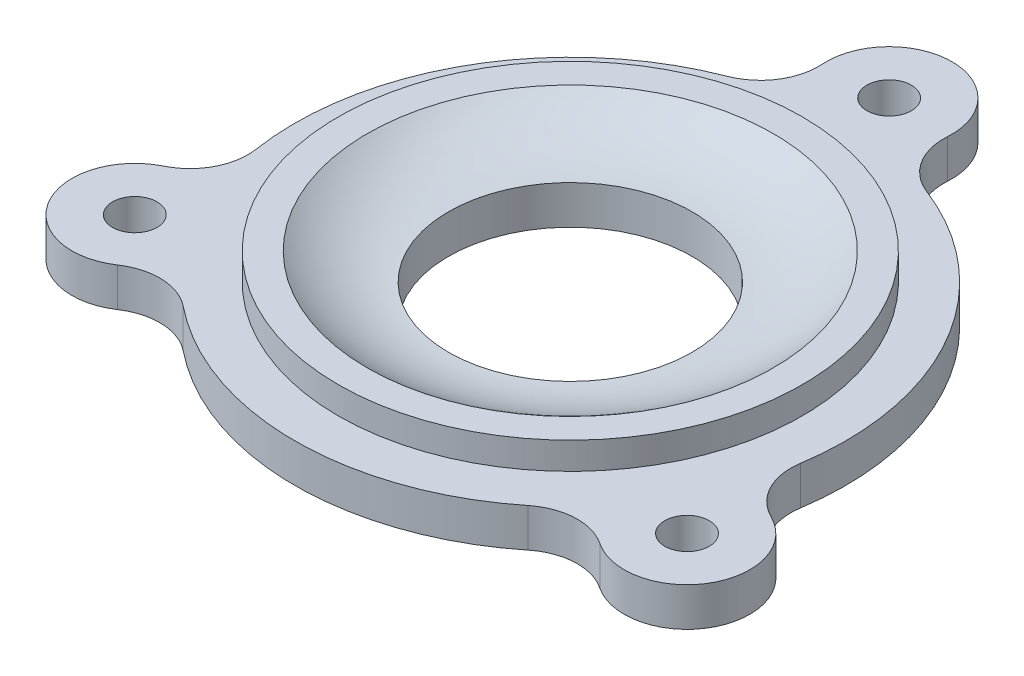
ISO-10303-21;
HEADER;
FILE_DESCRIPTION(('STEP AP214'),'2;1');
FILE_NAME('part.step','',(''),(''),'','','');
FILE_SCHEMA(('AUTOMOTIVE_DESIGN { 1 0 10303 214 1 1 1 1 }'));
ENDSEC;
DATA;
#1=APPLICATION_CONTEXT('core data for automotive mechanical design processes');
#2=APPLICATION_PROTOCOL_DEFINITION('international standard','automotive_design',2000,#1);
#3=PRODUCT_CONTEXT('',#1,'mechanical');
#4=PRODUCT('Part','Part','',(#3));
#5=PRODUCT_RELATED_PRODUCT_CATEGORY('part','',(#4));
#6=PRODUCT_DEFINITION_FORMATION('','',#4);
#7=PRODUCT_DEFINITION_CONTEXT('part definition',#1,'design');
#8=PRODUCT_DEFINITION('design','',#6,#7);
#9=PRODUCT_DEFINITION_SHAPE('','',#8);
#10=(LENGTH_UNIT() NAMED_UNIT(*) SI_UNIT(.MILLI.,.METRE.));
#11=(NAMED_UNIT(*) PLANE_ANGLE_UNIT() SI_UNIT($,.RADIAN.));
#12=(NAMED_UNIT(*) SI_UNIT($,.STERADIAN.) SOLID_ANGLE_UNIT());
#13=UNCERTAINTY_MEASURE_WITH_UNIT(LENGTH_MEASURE(1.E-05),#10,'distance_accuracy_value','');
#14=(GEOMETRIC_REPRESENTATION_CONTEXT(3) GLOBAL_UNCERTAINTY_ASSIGNED_CONTEXT((#13)) GLOBAL_UNIT_ASSIGNED_CONTEXT((#10,
#11,#12)) REPRESENTATION_CONTEXT('',''));
#15=CARTESIAN_POINT('',(0.,0.,0.));
#16=DIRECTION('',(0.,0.,1.));
#17=DIRECTION('',(1.,0.,0.));
#18=AXIS2_PLACEMENT_3D('',#15,#16,#17);
#19=CARTESIAN_POINT('',(-3.11802416625582,2.,-16.2813129169193));
#20=DIRECTION('',(0.,1.,0.));
#21=DIRECTION('',(0.,0.,1.));
#22=AXIS2_PLACEMENT_3D('',#19,#20,#21);
#23=PLANE('',#22);
#24=CARTESIAN_POINT('',(0.,2.,0.));
#25=DIRECTION('',(0.,1.,0.));
#26=DIRECTION('',(0.,0.,1.));
#27=AXIS2_PLACEMENT_3D('',#24,#25,#26);
#28=CIRCLE('',#27,12.);
#29=CARTESIAN_POINT('',(0.,2.,12.));
#30=VERTEX_POINT('',#29);
#31=EDGE_CURVE('E298',#30,#30,#28,.T.);
#32=ORIENTED_EDGE('',*,*,#31,.F.);
#33=EDGE_LOOP('',(#32));
#34=FACE_BOUND('',#33,.T.);
#35=CARTESIAN_POINT('',(14.2807589084054,2.,8.245));
#36=DIRECTION('',(0.,1.,0.));
#37=DIRECTION('',(0.,0.,1.));
#38=AXIS2_PLACEMENT_3D('',#35,#36,#37);
#39=CIRCLE('',#38,1.15);
#40=CARTESIAN_POINT('',(14.2807589084054,2.,9.395));
#41=VERTEX_POINT('',#40);
#42=EDGE_CURVE('E311',#41,#41,#39,.T.);
#43=ORIENTED_EDGE('',*,*,#42,.F.);
#44=EDGE_LOOP('',(#43));
#45=FACE_BOUND('',#44,.T.);
#46=CARTESIAN_POINT('',(0.,2.,-16.49));
#47=DIRECTION('',(0.,1.,0.));
#48=DIRECTION('',(0.,0.,1.));
#49=AXIS2_PLACEMENT_3D('',#46,#47,#48);
#50=CIRCLE('',#49,1.15);
#51=CARTESIAN_POINT('',(0.,2.,-15.34));
#52=VERTEX_POINT('',#51);
#53=EDGE_CURVE('E160',#52,#52,#50,.T.);
#54=ORIENTED_EDGE('',*,*,#53,.F.);
#55=EDGE_LOOP('',(#54));
#56=FACE_BOUND('',#55,.T.);
#57=CARTESIAN_POINT('',(-6.23604833251164,2.,-16.0726258338387));
#58=DIRECTION('',(0.,-1.,0.));
#59=DIRECTION('',(0.,0.,1.));
#60=AXIS2_PLACEMENT_3D('',#57,#58,#59);
#61=CIRCLE('',#60,3.);
#62=CARTESIAN_POINT('',(-3.24274513290605,2.,-16.2729654335961));
#63=VERTEX_POINT('',#62);
#64=CARTESIAN_POINT('',(-5.1508891099168,2.,-13.2757651898992));
#65=VERTEX_POINT('',#64);
#66=EDGE_CURVE('E179',#63,#65,#61,.T.);
#67=ORIENTED_EDGE('',*,*,#66,.T.);
#68=CARTESIAN_POINT('',(0.,2.,0.));
#69=DIRECTION('',(0.,1.,0.));
#70=DIRECTION('',(0.,0.,1.));
#71=AXIS2_PLACEMENT_3D('',#68,#69,#70);
#72=CIRCLE('',#71,14.24);
#73=CARTESIAN_POINT('',(-14.0725944640883,2.,2.17708177368505));
#74=VERTEX_POINT('',#73);
#75=EDGE_CURVE('E107',#65,#74,#72,.T.);
#76=ORIENTED_EDGE('',*,*,#75,.T.);
#77=CARTESIAN_POINT('',(-17.0373264438822,2.,2.63573664173669));
#78=DIRECTION('',(0.,-1.,0.));
#79=DIRECTION('',(0.,0.,-1.));
#80=AXIS2_PLACEMENT_3D('',#77,#78,#79);
#81=CIRCLE('',#80,3.);
#82=CARTESIAN_POINT('',(-15.7141740268533,2.,5.32818305370308));
#83=VERTEX_POINT('',#82);
#84=EDGE_CURVE('E206',#74,#83,#81,.T.);
#85=ORIENTED_EDGE('',*,*,#84,.T.);
#86=CARTESIAN_POINT('',(-14.2807589084054,2.,8.24500000000001));
#87=DIRECTION('',(0.,1.,0.));
#88=DIRECTION('',(0.,0.,1.));
#89=AXIS2_PLACEMENT_3D('',#86,#87,#88);
#90=CIRCLE('',#89,3.25);
#91=CARTESIAN_POINT('',(-12.4714288939473,2.,10.9447823798931));
#92=VERTEX_POINT('',#91);
#93=EDGE_CURVE('E225',#83,#92,#90,.T.);
#94=ORIENTED_EDGE('',*,*,#93,.T.);
#95=CARTESIAN_POINT('',(-10.8012781113705,2.,13.436889192102));
#96=DIRECTION('',(0.,-1.,0.));
#97=DIRECTION('',(0.,0.,1.));
#98=AXIS2_PLACEMENT_3D('',#95,#96,#97);
#99=CIRCLE('',#98,3.);
#100=CARTESIAN_POINT('',(-8.92170535417148,2.,11.0986834162142));
#101=VERTEX_POINT('',#100);
#102=EDGE_CURVE('E222',#92,#101,#99,.T.);
#103=ORIENTED_EDGE('',*,*,#102,.T.);
#104=CARTESIAN_POINT('',(0.,2.,0.));
#105=DIRECTION('',(0.,1.,0.));
#106=DIRECTION('',(0.,0.,1.));
#107=AXIS2_PLACEMENT_3D('',#104,#105,#106);
#108=CIRCLE('',#107,14.24);
#109=CARTESIAN_POINT('',(8.92170535417149,2.,11.0986834162142));
#110=VERTEX_POINT('',#109);
#111=EDGE_CURVE('E224',#101,#110,#108,.T.);
#112=ORIENTED_EDGE('',*,*,#111,.T.);
#113=CARTESIAN_POINT('',(10.8012781113705,2.,13.436889192102));
#114=DIRECTION('',(0.,-1.,0.));
#115=DIRECTION('',(0.,0.,-1.));
#116=AXIS2_PLACEMENT_3D('',#113,#114,#115);
#117=CIRCLE('',#116,3.);
#118=CARTESIAN_POINT('',(12.4714288939473,2.,10.944782379893));
#119=VERTEX_POINT('',#118);
#120=EDGE_CURVE('E227',#110,#119,#117,.T.);
#121=ORIENTED_EDGE('',*,*,#120,.T.);
#122=CARTESIAN_POINT('',(14.2807589084054,2.,8.245));
#123=DIRECTION('',(0.,1.,0.));
#124=DIRECTION('',(0.,0.,1.));
#125=AXIS2_PLACEMENT_3D('',#122,#123,#124);
#126=CIRCLE('',#125,3.25);
#127=CARTESIAN_POINT('',(15.7141740268533,2.,5.32818305370307));
#128=VERTEX_POINT('',#127);
#129=EDGE_CURVE('E233',#119,#128,#126,.T.);
#130=ORIENTED_EDGE('',*,*,#129,.T.);
#131=CARTESIAN_POINT('',(17.0373264438822,2.,2.63573664173668));
#132=DIRECTION('',(0.,-1.,0.));
#133=DIRECTION('',(0.,0.,1.));
#134=AXIS2_PLACEMENT_3D('',#131,#132,#133);
#135=CIRCLE('',#134,3.);
#136=CARTESIAN_POINT('',(14.0725944640883,2.,2.17708177368505));
#137=VERTEX_POINT('',#136);
#138=EDGE_CURVE('E138',#128,#137,#135,.T.);
#139=ORIENTED_EDGE('',*,*,#138,.T.);
#140=CARTESIAN_POINT('',(0.,2.,0.));
#141=DIRECTION('',(0.,1.,0.));
#142=DIRECTION('',(0.,0.,1.));
#143=AXIS2_PLACEMENT_3D('',#140,#141,#142);
#144=CIRCLE('',#143,14.24);
#145=CARTESIAN_POINT('',(5.15088910991681,2.,-13.2757651898992));
#146=VERTEX_POINT('',#145);
#147=EDGE_CURVE('E132',#137,#146,#144,.T.);
#148=ORIENTED_EDGE('',*,*,#147,.T.);
#149=CARTESIAN_POINT('',(6.23604833251164,2.,-16.0726258338387));
#150=DIRECTION('',(0.,-1.,0.));
#151=DIRECTION('',(0.,0.,-1.));
#152=AXIS2_PLACEMENT_3D('',#149,#150,#151);
#153=CIRCLE('',#152,3.);
#154=CARTESIAN_POINT('',(3.24274513290605,2.,-16.2729654335961));
#155=VERTEX_POINT('',#154);
#156=EDGE_CURVE('E136',#146,#155,#153,.T.);
#157=ORIENTED_EDGE('',*,*,#156,.T.);
#158=CARTESIAN_POINT('',(0.,2.,-16.49));
#159=DIRECTION('',(0.,1.,0.));
#160=DIRECTION('',(0.,0.,1.));
#161=AXIS2_PLACEMENT_3D('',#158,#159,#160);
#162=CIRCLE('',#161,3.25);
#163=EDGE_CURVE('E52',#155,#63,#162,.T.);
#164=ORIENTED_EDGE('',*,*,#163,.T.);
#165=EDGE_LOOP('',(#67,#76,#85,#94,#103,#112,#121,#130,#139,#148,#157,#164));
#166=FACE_BOUND('',#165,.T.);
#167=CARTESIAN_POINT('',(-14.2807589084054,2.,8.24500000000001));
#168=DIRECTION('',(0.,1.,0.));
#169=DIRECTION('',(0.,0.,1.));
#170=AXIS2_PLACEMENT_3D('',#167,#168,#169);
#171=CIRCLE('',#170,1.15);
#172=CARTESIAN_POINT('',(-14.2807589084054,2.,9.395));
#173=VERTEX_POINT('',#172);
#174=EDGE_CURVE('E305',#173,#173,#171,.T.);
#175=ORIENTED_EDGE('',*,*,#174,.F.);
#176=EDGE_LOOP('',(#175));
#177=FACE_BOUND('',#176,.T.);
#178=ADVANCED_FACE('F35',(#34,#45,#56,#166,#177),#23,.T.);
#179=CARTESIAN_POINT('',(-3.11802416625582,0.,-16.2813129169193));
#180=DIRECTION('',(0.,1.,0.));
#181=DIRECTION('',(0.,0.,1.));
#182=AXIS2_PLACEMENT_3D('',#179,#180,#181);
#183=PLANE('',#182);
#184=CARTESIAN_POINT('',(-6.23604833251164,0.,-16.0726258338387));
#185=DIRECTION('',(0.,-1.,0.));
#186=DIRECTION('',(0.,0.,1.));
#187=AXIS2_PLACEMENT_3D('',#184,#185,#186);
#188=CIRCLE('',#187,3.);
#189=CARTESIAN_POINT('',(-3.24274513290605,0.,-16.2729654335961));
#190=VERTEX_POINT('',#189);
#191=CARTESIAN_POINT('',(-5.1508891099168,0.,-13.2757651898992));
#192=VERTEX_POINT('',#191);
#193=EDGE_CURVE('E156',#190,#192,#188,.T.);
#194=ORIENTED_EDGE('',*,*,#193,.F.);
#195=CARTESIAN_POINT('',(0.,0.,-16.49));
#196=DIRECTION('',(0.,1.,0.));
#197=DIRECTION('',(0.,0.,1.));
#198=AXIS2_PLACEMENT_3D('',#195,#196,#197);
#199=CIRCLE('',#198,3.25);
#200=CARTESIAN_POINT('',(3.24274513290605,0.,-16.2729654335961));
#201=VERTEX_POINT('',#200);
#202=EDGE_CURVE('E99',#201,#190,#199,.T.);
#203=ORIENTED_EDGE('',*,*,#202,.F.);
#204=CARTESIAN_POINT('',(6.23604833251164,0.,-16.0726258338387));
#205=DIRECTION('',(0.,-1.,0.));
#206=DIRECTION('',(0.,0.,-1.));
#207=AXIS2_PLACEMENT_3D('',#204,#205,#206);
#208=CIRCLE('',#207,3.);
#209=CARTESIAN_POINT('',(5.15088910991681,0.,-13.2757651898992));
#210=VERTEX_POINT('',#209);
#211=EDGE_CURVE('E93',#210,#201,#208,.T.);
#212=ORIENTED_EDGE('',*,*,#211,.F.);
#213=CARTESIAN_POINT('',(0.,0.,0.));
#214=DIRECTION('',(0.,1.,0.));
#215=DIRECTION('',(0.,0.,1.));
#216=AXIS2_PLACEMENT_3D('',#213,#214,#215);
#217=CIRCLE('',#216,14.24);
#218=CARTESIAN_POINT('',(14.0725944640883,0.,2.17708177368505));
#219=VERTEX_POINT('',#218);
#220=EDGE_CURVE('E146',#219,#210,#217,.T.);
#221=ORIENTED_EDGE('',*,*,#220,.F.);
#222=CARTESIAN_POINT('',(17.0373264438822,0.,2.63573664173668));
#223=DIRECTION('',(0.,-1.,0.));
#224=DIRECTION('',(0.,0.,1.));
#225=AXIS2_PLACEMENT_3D('',#222,#223,#224);
#226=CIRCLE('',#225,3.);
#227=CARTESIAN_POINT('',(15.7141740268533,0.,5.32818305370307));
#228=VERTEX_POINT('',#227);
#229=EDGE_CURVE('E174',#228,#219,#226,.T.);
#230=ORIENTED_EDGE('',*,*,#229,.F.);
#231=CARTESIAN_POINT('',(14.2807589084054,0.,8.245));
#232=DIRECTION('',(0.,1.,0.));
#233=DIRECTION('',(0.,0.,1.));
#234=AXIS2_PLACEMENT_3D('',#231,#232,#233);
#235=CIRCLE('',#234,3.25);
#236=CARTESIAN_POINT('',(12.4714288939473,0.,10.944782379893));
#237=VERTEX_POINT('',#236);
#238=EDGE_CURVE('E172',#237,#228,#235,.T.);
#239=ORIENTED_EDGE('',*,*,#238,.F.);
#240=CARTESIAN_POINT('',(10.8012781113705,0.,13.436889192102));
#241=DIRECTION('',(0.,-1.,0.));
#242=DIRECTION('',(0.,0.,-1.));
#243=AXIS2_PLACEMENT_3D('',#240,#241,#242);
#244=CIRCLE('',#243,3.);
#245=CARTESIAN_POINT('',(8.92170535417149,0.,11.0986834162142));
#246=VERTEX_POINT('',#245);
#247=EDGE_CURVE('E170',#246,#237,#244,.T.);
#248=ORIENTED_EDGE('',*,*,#247,.F.);
#249=CARTESIAN_POINT('',(0.,0.,0.));
#250=DIRECTION('',(0.,1.,0.));
#251=DIRECTION('',(0.,0.,1.));
#252=AXIS2_PLACEMENT_3D('',#249,#250,#251);
#253=CIRCLE('',#252,14.24);
#254=CARTESIAN_POINT('',(-8.92170535417148,0.,11.0986834162142));
#255=VERTEX_POINT('',#254);
#256=EDGE_CURVE('E168',#255,#246,#253,.T.);
#257=ORIENTED_EDGE('',*,*,#256,.F.);
#258=CARTESIAN_POINT('',(-10.8012781113705,0.,13.436889192102));
#259=DIRECTION('',(0.,-1.,0.));
#260=DIRECTION('',(0.,0.,1.));
#261=AXIS2_PLACEMENT_3D('',#258,#259,#260);
#262=CIRCLE('',#261,3.);
#263=CARTESIAN_POINT('',(-12.4714288939473,0.,10.9447823798931));
#264=VERTEX_POINT('',#263);
#265=EDGE_CURVE('E166',#264,#255,#262,.T.);
#266=ORIENTED_EDGE('',*,*,#265,.F.);
#267=CARTESIAN_POINT('',(-14.2807589084054,0.,8.24500000000001));
#268=DIRECTION('',(0.,1.,0.));
#269=DIRECTION('',(0.,0.,1.));
#270=AXIS2_PLACEMENT_3D('',#267,#268,#269);
#271=CIRCLE('',#270,3.25);
#272=CARTESIAN_POINT('',(-15.7141740268533,0.,5.32818305370308));
#273=VERTEX_POINT('',#272);
#274=EDGE_CURVE('E164',#273,#264,#271,.T.);
#275=ORIENTED_EDGE('',*,*,#274,.F.);
#276=CARTESIAN_POINT('',(-17.0373264438822,0.,2.63573664173669));
#277=DIRECTION('',(0.,-1.,0.));
#278=DIRECTION('',(0.,0.,-1.));
#279=AXIS2_PLACEMENT_3D('',#276,#277,#278);
#280=CIRCLE('',#279,3.);
#281=CARTESIAN_POINT('',(-14.0725944640883,0.,2.17708177368505));
#282=VERTEX_POINT('',#281);
#283=EDGE_CURVE('E162',#282,#273,#280,.T.);
#284=ORIENTED_EDGE('',*,*,#283,.F.);
#285=CARTESIAN_POINT('',(0.,0.,0.));
#286=DIRECTION('',(0.,1.,0.));
#287=DIRECTION('',(0.,0.,1.));
#288=AXIS2_PLACEMENT_3D('',#285,#286,#287);
#289=CIRCLE('',#288,14.24);
#290=EDGE_CURVE('E159',#192,#282,#289,.T.);
#291=ORIENTED_EDGE('',*,*,#290,.F.);
#292=EDGE_LOOP('',(#194,#203,#212,#221,#230,#239,#248,#257,#266,#275,#284,#291));
#293=FACE_BOUND('',#292,.T.);
#294=CARTESIAN_POINT('',(0.,0.,-16.49));
#295=DIRECTION('',(0.,1.,0.));
#296=DIRECTION('',(0.,0.,1.));
#297=AXIS2_PLACEMENT_3D('',#294,#295,#296);
#298=CIRCLE('',#297,1.15);
#299=CARTESIAN_POINT('',(0.,0.,-15.34));
#300=VERTEX_POINT('',#299);
#301=EDGE_CURVE('E320',#300,#300,#298,.T.);
#302=ORIENTED_EDGE('',*,*,#301,.T.);
#303=EDGE_LOOP('',(#302));
#304=FACE_BOUND('',#303,.T.);
#305=CARTESIAN_POINT('',(0.,0.,0.));
#306=DIRECTION('',(0.,1.,0.));
#307=DIRECTION('',(0.,0.,1.));
#308=AXIS2_PLACEMENT_3D('',#305,#306,#307);
#309=CIRCLE('',#308,6.3);
#310=CARTESIAN_POINT('',(0.,0.,6.3));
#311=VERTEX_POINT('',#310);
#312=EDGE_CURVE('E314',#311,#311,#309,.T.);
#313=ORIENTED_EDGE('',*,*,#312,.T.);
#314=EDGE_LOOP('',(#313));
#315=FACE_BOUND('',#314,.T.);
#316=CARTESIAN_POINT('',(14.2807589084054,0.,8.245));
#317=DIRECTION('',(0.,1.,0.));
#318=DIRECTION('',(0.,0.,1.));
#319=AXIS2_PLACEMENT_3D('',#316,#317,#318);
#320=CIRCLE('',#319,1.15);
#321=CARTESIAN_POINT('',(14.2807589084054,0.,9.395));
#322=VERTEX_POINT('',#321);
#323=EDGE_CURVE('E308',#322,#322,#320,.T.);
#324=ORIENTED_EDGE('',*,*,#323,.T.);
#325=EDGE_LOOP('',(#324));
#326=FACE_BOUND('',#325,.T.);
#327=CARTESIAN_POINT('',(-14.2807589084054,0.,8.24500000000001));
#328=DIRECTION('',(0.,1.,0.));
#329=DIRECTION('',(0.,0.,1.));
#330=AXIS2_PLACEMENT_3D('',#327,#328,#329);
#331=CIRCLE('',#330,1.15);
#332=CARTESIAN_POINT('',(-14.2807589084054,0.,9.395));
#333=VERTEX_POINT('',#332);
#334=EDGE_CURVE('E303',#333,#333,#331,.T.);
#335=ORIENTED_EDGE('',*,*,#334,.T.);
#336=EDGE_LOOP('',(#335));
#337=FACE_BOUND('',#336,.T.);
#338=ADVANCED_FACE('F210',(#293,#304,#315,#326,#337),#183,.F.);
#339=CARTESIAN_POINT('',(-6.23604833251164,2.,-16.0726258338387));
#340=DIRECTION('',(0.,-1.,0.));
#341=DIRECTION('',(0.,0.,-1.));
#342=AXIS2_PLACEMENT_3D('',#339,#340,#341);
#343=CYLINDRICAL_SURFACE('',#342,3.);
#344=ORIENTED_EDGE('',*,*,#193,.T.);
#345=DIRECTION('',(0.,-1.,0.));
#346=VECTOR('',#345,1.);
#347=CARTESIAN_POINT('',(-5.1508891099168,2.,-13.2757651898992));
#348=LINE('',#347,#346);
#349=EDGE_CURVE('E11',#65,#192,#348,.T.);
#350=ORIENTED_EDGE('',*,*,#349,.F.);
#351=ORIENTED_EDGE('',*,*,#66,.F.);
#352=DIRECTION('',(0.,-1.,0.));
#353=VECTOR('',#352,1.);
#354=CARTESIAN_POINT('',(-3.24274513290605,2.,-16.2729654335961));
#355=LINE('',#354,#353);
#356=EDGE_CURVE('E152',#63,#190,#355,.T.);
#357=ORIENTED_EDGE('',*,*,#356,.T.);
#358=EDGE_LOOP('',(#344,#350,#351,#357));
#359=FACE_BOUND('',#358,.T.);
#360=ADVANCED_FACE('F246',(#359),#343,.F.);
#361=CARTESIAN_POINT('',(0.,2.,0.));
#362=DIRECTION('',(0.,-1.,0.));
#363=DIRECTION('',(0.,0.,-1.));
#364=AXIS2_PLACEMENT_3D('',#361,#362,#363);
#365=CYLINDRICAL_SURFACE('',#364,14.24);
#366=ORIENTED_EDGE('',*,*,#290,.T.);
#367=DIRECTION('',(0.,-1.,0.));
#368=VECTOR('',#367,1.);
#369=CARTESIAN_POINT('',(-14.0725944640883,2.,2.17708177368505));
#370=LINE('',#369,#368);
#371=EDGE_CURVE('E44',#74,#282,#370,.T.);
#372=ORIENTED_EDGE('',*,*,#371,.F.);
#373=ORIENTED_EDGE('',*,*,#75,.F.);
#374=ORIENTED_EDGE('',*,*,#349,.T.);
#375=EDGE_LOOP('',(#366,#372,#373,#374));
#376=FACE_BOUND('',#375,.T.);
#377=ADVANCED_FACE('F462',(#376),#365,.T.);
#378=CARTESIAN_POINT('',(-17.0373264438822,2.,2.63573664173669));
#379=DIRECTION('',(0.,-1.,0.));
#380=DIRECTION('',(0.,0.,-1.));
#381=AXIS2_PLACEMENT_3D('',#378,#379,#380);
#382=CYLINDRICAL_SURFACE('',#381,3.);
#383=ORIENTED_EDGE('',*,*,#283,.T.);
#384=DIRECTION('',(0.,-1.,0.));
#385=VECTOR('',#384,1.);
#386=CARTESIAN_POINT('',(-15.7141740268533,2.,5.32818305370308));
#387=LINE('',#386,#385);
#388=EDGE_CURVE('E198',#83,#273,#387,.T.);
#389=ORIENTED_EDGE('',*,*,#388,.F.);
#390=ORIENTED_EDGE('',*,*,#84,.F.);
#391=ORIENTED_EDGE('',*,*,#371,.T.);
#392=EDGE_LOOP('',(#383,#389,#390,#391));
#393=FACE_BOUND('',#392,.T.);
#394=ADVANCED_FACE('F204',(#393),#382,.F.);
#395=CARTESIAN_POINT('',(-14.2807589084054,2.,8.24500000000001));
#396=DIRECTION('',(0.,-1.,0.));
#397=DIRECTION('',(0.,0.,-1.));
#398=AXIS2_PLACEMENT_3D('',#395,#396,#397);
#399=CYLINDRICAL_SURFACE('',#398,3.25);
#400=ORIENTED_EDGE('',*,*,#274,.T.);
#401=DIRECTION('',(0.,-1.,0.));
#402=VECTOR('',#401,1.);
#403=CARTESIAN_POINT('',(-12.4714288939473,2.,10.9447823798931));
#404=LINE('',#403,#402);
#405=EDGE_CURVE('E195',#92,#264,#404,.T.);
#406=ORIENTED_EDGE('',*,*,#405,.F.);
#407=ORIENTED_EDGE('',*,*,#93,.F.);
#408=ORIENTED_EDGE('',*,*,#388,.T.);
#409=EDGE_LOOP('',(#400,#406,#407,#408));
#410=FACE_BOUND('',#409,.T.);
#411=ADVANCED_FACE('F216',(#410),#399,.T.);
#412=CARTESIAN_POINT('',(-10.8012781113705,2.,13.436889192102));
#413=DIRECTION('',(0.,-1.,0.));
#414=DIRECTION('',(0.,0.,-1.));
#415=AXIS2_PLACEMENT_3D('',#412,#413,#414);
#416=CYLINDRICAL_SURFACE('',#415,3.);
#417=ORIENTED_EDGE('',*,*,#265,.T.);
#418=DIRECTION('',(0.,-1.,0.));
#419=VECTOR('',#418,1.);
#420=CARTESIAN_POINT('',(-8.92170535417148,2.,11.0986834162142));
#421=LINE('',#420,#419);
#422=EDGE_CURVE('E192',#101,#255,#421,.T.);
#423=ORIENTED_EDGE('',*,*,#422,.F.);
#424=ORIENTED_EDGE('',*,*,#102,.F.);
#425=ORIENTED_EDGE('',*,*,#405,.T.);
#426=EDGE_LOOP('',(#417,#423,#424,#425));
#427=FACE_BOUND('',#426,.T.);
#428=ADVANCED_FACE('F220',(#427),#416,.F.);
#429=CARTESIAN_POINT('',(0.,2.,0.));
#430=DIRECTION('',(0.,-1.,0.));
#431=DIRECTION('',(0.,0.,-1.));
#432=AXIS2_PLACEMENT_3D('',#429,#430,#431);
#433=CYLINDRICAL_SURFACE('',#432,14.24);
#434=ORIENTED_EDGE('',*,*,#256,.T.);
#435=DIRECTION('',(0.,-1.,0.));
#436=VECTOR('',#435,1.);
#437=CARTESIAN_POINT('',(8.92170535417149,2.,11.0986834162142));
#438=LINE('',#437,#436);
#439=EDGE_CURVE('E189',#110,#246,#438,.T.);
#440=ORIENTED_EDGE('',*,*,#439,.F.);
#441=ORIENTED_EDGE('',*,*,#111,.F.);
#442=ORIENTED_EDGE('',*,*,#422,.T.);
#443=EDGE_LOOP('',(#434,#440,#441,#442));
#444=FACE_BOUND('',#443,.T.);
#445=ADVANCED_FACE('F427',(#444),#433,.T.);
#446=CARTESIAN_POINT('',(10.8012781113705,2.,13.436889192102));
#447=DIRECTION('',(0.,-1.,0.));
#448=DIRECTION('',(0.,0.,-1.));
#449=AXIS2_PLACEMENT_3D('',#446,#447,#448);
#450=CYLINDRICAL_SURFACE('',#449,3.);
#451=ORIENTED_EDGE('',*,*,#247,.T.);
#452=DIRECTION('',(0.,-1.,0.));
#453=VECTOR('',#452,1.);
#454=CARTESIAN_POINT('',(12.4714288939473,2.,10.944782379893));
#455=LINE('',#454,#453);
#456=EDGE_CURVE('E186',#119,#237,#455,.T.);
#457=ORIENTED_EDGE('',*,*,#456,.F.);
#458=ORIENTED_EDGE('',*,*,#120,.F.);
#459=ORIENTED_EDGE('',*,*,#439,.T.);
#460=EDGE_LOOP('',(#451,#457,#458,#459));
#461=FACE_BOUND('',#460,.T.);
#462=ADVANCED_FACE('F418',(#461),#450,.F.);
#463=CARTESIAN_POINT('',(14.2807589084054,2.,8.245));
#464=DIRECTION('',(0.,-1.,0.));
#465=DIRECTION('',(0.,0.,-1.));
#466=AXIS2_PLACEMENT_3D('',#463,#464,#465);
#467=CYLINDRICAL_SURFACE('',#466,3.25);
#468=ORIENTED_EDGE('',*,*,#238,.T.);
#469=DIRECTION('',(0.,-1.,0.));
#470=VECTOR('',#469,1.);
#471=CARTESIAN_POINT('',(15.7141740268533,2.,5.32818305370307));
#472=LINE('',#471,#470);
#473=EDGE_CURVE('E183',#128,#228,#472,.T.);
#474=ORIENTED_EDGE('',*,*,#473,.F.);
#475=ORIENTED_EDGE('',*,*,#129,.F.);
#476=ORIENTED_EDGE('',*,*,#456,.T.);
#477=EDGE_LOOP('',(#468,#474,#475,#476));
#478=FACE_BOUND('',#477,.T.);
#479=ADVANCED_FACE('F239',(#478),#467,.T.);
#480=CARTESIAN_POINT('',(17.0373264438822,2.,2.63573664173668));
#481=DIRECTION('',(0.,-1.,0.));
#482=DIRECTION('',(0.,0.,-1.));
#483=AXIS2_PLACEMENT_3D('',#480,#481,#482);
#484=CYLINDRICAL_SURFACE('',#483,3.);
#485=ORIENTED_EDGE('',*,*,#229,.T.);
#486=DIRECTION('',(0.,-1.,0.));
#487=VECTOR('',#486,1.);
#488=CARTESIAN_POINT('',(14.0725944640883,2.,2.17708177368505));
#489=LINE('',#488,#487);
#490=EDGE_CURVE('E147',#137,#219,#489,.T.);
#491=ORIENTED_EDGE('',*,*,#490,.F.);
#492=ORIENTED_EDGE('',*,*,#138,.F.);
#493=ORIENTED_EDGE('',*,*,#473,.T.);
#494=EDGE_LOOP('',(#485,#491,#492,#493));
#495=FACE_BOUND('',#494,.T.);
#496=ADVANCED_FACE('F243',(#495),#484,.F.);
#497=CARTESIAN_POINT('',(0.,2.,0.));
#498=DIRECTION('',(0.,-1.,0.));
#499=DIRECTION('',(0.,0.,-1.));
#500=AXIS2_PLACEMENT_3D('',#497,#498,#499);
#501=CYLINDRICAL_SURFACE('',#500,14.24);
#502=ORIENTED_EDGE('',*,*,#220,.T.);
#503=DIRECTION('',(0.,-1.,0.));
#504=VECTOR('',#503,1.);
#505=CARTESIAN_POINT('',(5.15088910991681,2.,-13.2757651898992));
#506=LINE('',#505,#504);
#507=EDGE_CURVE('E143',#146,#210,#506,.T.);
#508=ORIENTED_EDGE('',*,*,#507,.F.);
#509=ORIENTED_EDGE('',*,*,#147,.F.);
#510=ORIENTED_EDGE('',*,*,#490,.T.);
#511=EDGE_LOOP('',(#502,#508,#509,#510));
#512=FACE_BOUND('',#511,.T.);
#513=ADVANCED_FACE('F144',(#512),#501,.T.);
#514=CARTESIAN_POINT('',(6.23604833251164,2.,-16.0726258338387));
#515=DIRECTION('',(0.,-1.,0.));
#516=DIRECTION('',(0.,0.,-1.));
#517=AXIS2_PLACEMENT_3D('',#514,#515,#516);
#518=CYLINDRICAL_SURFACE('',#517,3.);
#519=ORIENTED_EDGE('',*,*,#211,.T.);
#520=DIRECTION('',(0.,-1.,0.));
#521=VECTOR('',#520,1.);
#522=CARTESIAN_POINT('',(3.24274513290605,2.,-16.2729654335961));
#523=LINE('',#522,#521);
#524=EDGE_CURVE('E148',#155,#201,#523,.T.);
#525=ORIENTED_EDGE('',*,*,#524,.F.);
#526=ORIENTED_EDGE('',*,*,#156,.F.);
#527=ORIENTED_EDGE('',*,*,#507,.T.);
#528=EDGE_LOOP('',(#519,#525,#526,#527));
#529=FACE_BOUND('',#528,.T.);
#530=ADVANCED_FACE('F150',(#529),#518,.F.);
#531=CARTESIAN_POINT('',(0.,2.,-16.49));
#532=DIRECTION('',(0.,-1.,0.));
#533=DIRECTION('',(0.,0.,-1.));
#534=AXIS2_PLACEMENT_3D('',#531,#532,#533);
#535=CYLINDRICAL_SURFACE('',#534,3.25);
#536=ORIENTED_EDGE('',*,*,#202,.T.);
#537=ORIENTED_EDGE('',*,*,#356,.F.);
#538=ORIENTED_EDGE('',*,*,#163,.F.);
#539=ORIENTED_EDGE('',*,*,#524,.T.);
#540=EDGE_LOOP('',(#536,#537,#538,#539));
#541=FACE_BOUND('',#540,.T.);
#542=ADVANCED_FACE('F248',(#541),#535,.T.);
#543=CARTESIAN_POINT('',(0.,2.,-16.49));
#544=DIRECTION('',(0.,-1.,0.));
#545=DIRECTION('',(0.,0.,-1.));
#546=AXIS2_PLACEMENT_3D('',#543,#544,#545);
#547=CYLINDRICAL_SURFACE('',#546,1.15);
#548=ORIENTED_EDGE('',*,*,#53,.T.);
#549=EDGE_LOOP('',(#548));
#550=FACE_BOUND('',#549,.T.);
#551=ORIENTED_EDGE('',*,*,#301,.F.);
#552=EDGE_LOOP('',(#551));
#553=FACE_BOUND('',#552,.T.);
#554=ADVANCED_FACE('F250',(#550,#553),#547,.F.);
#555=CARTESIAN_POINT('',(0.,2.,0.));
#556=DIRECTION('',(0.,-1.,0.));
#557=DIRECTION('',(0.,0.,-1.));
#558=AXIS2_PLACEMENT_3D('',#555,#556,#557);
#559=CYLINDRICAL_SURFACE('',#558,6.3);
#560=CARTESIAN_POINT('',(0.,2.,0.));
#561=DIRECTION('',(0.,1.,0.));
#562=DIRECTION('',(0.,0.,1.));
#563=AXIS2_PLACEMENT_3D('',#560,#561,#562);
#564=CIRCLE('',#563,6.3);
#565=CARTESIAN_POINT('',(0.,2.,6.3));
#566=VERTEX_POINT('',#565);
#567=EDGE_CURVE('E317',#566,#566,#564,.T.);
#568=ORIENTED_EDGE('',*,*,#567,.T.);
#569=EDGE_LOOP('',(#568));
#570=FACE_BOUND('',#569,.T.);
#571=ORIENTED_EDGE('',*,*,#312,.F.);
#572=EDGE_LOOP('',(#571));
#573=FACE_BOUND('',#572,.T.);
#574=ADVANCED_FACE('F256',(#570,#573),#559,.F.);
#575=CARTESIAN_POINT('',(14.2807589084054,2.,8.245));
#576=DIRECTION('',(0.,-1.,0.));
#577=DIRECTION('',(0.,0.,-1.));
#578=AXIS2_PLACEMENT_3D('',#575,#576,#577);
#579=CYLINDRICAL_SURFACE('',#578,1.15);
#580=ORIENTED_EDGE('',*,*,#42,.T.);
#581=EDGE_LOOP('',(#580));
#582=FACE_BOUND('',#581,.T.);
#583=ORIENTED_EDGE('',*,*,#323,.F.);
#584=EDGE_LOOP('',(#583));
#585=FACE_BOUND('',#584,.T.);
#586=ADVANCED_FACE('F272',(#582,#585),#579,.F.);
#587=CARTESIAN_POINT('',(-14.2807589084054,2.,8.24500000000001));
#588=DIRECTION('',(0.,-1.,0.));
#589=DIRECTION('',(0.,0.,-1.));
#590=AXIS2_PLACEMENT_3D('',#587,#588,#589);
#591=CYLINDRICAL_SURFACE('',#590,1.15);
#592=ORIENTED_EDGE('',*,*,#174,.T.);
#593=EDGE_LOOP('',(#592));
#594=FACE_BOUND('',#593,.T.);
#595=ORIENTED_EDGE('',*,*,#334,.F.);
#596=EDGE_LOOP('',(#595));
#597=FACE_BOUND('',#596,.T.);
#598=ADVANCED_FACE('F276',(#594,#597),#591,.F.);
#599=CARTESIAN_POINT('',(0.,3.4,0.));
#600=DIRECTION('',(0.,1.,0.));
#601=DIRECTION('',(0.,0.,1.));
#602=AXIS2_PLACEMENT_3D('',#599,#600,#601);
#603=PLANE('',#602);
#604=CARTESIAN_POINT('',(0.,3.4,0.));
#605=DIRECTION('',(0.,1.,0.));
#606=DIRECTION('',(0.,0.,1.));
#607=AXIS2_PLACEMENT_3D('',#604,#605,#606);
#608=CIRCLE('',#607,12.);
#609=CARTESIAN_POINT('',(0.,3.4,12.));
#610=VERTEX_POINT('',#609);
#611=EDGE_CURVE('E293',#610,#610,#608,.T.);
#612=ORIENTED_EDGE('',*,*,#611,.T.);
#613=EDGE_LOOP('',(#612));
#614=FACE_BOUND('',#613,.T.);
#615=CARTESIAN_POINT('',(0.,3.4,0.));
#616=DIRECTION('',(0.,1.,0.));
#617=DIRECTION('',(0.,0.,1.));
#618=AXIS2_PLACEMENT_3D('',#615,#616,#617);
#619=CIRCLE('',#618,10.5);
#620=CARTESIAN_POINT('',(0.,3.4,10.5));
#621=VERTEX_POINT('',#620);
#622=EDGE_CURVE('E296',#621,#621,#619,.T.);
#623=ORIENTED_EDGE('',*,*,#622,.F.);
#624=EDGE_LOOP('',(#623));
#625=FACE_BOUND('',#624,.T.);
#626=ADVANCED_FACE('F280',(#614,#625),#603,.T.);
#627=CARTESIAN_POINT('',(0.,3.4,0.));
#628=DIRECTION('',(0.,-1.,0.));
#629=DIRECTION('',(0.,0.,-1.));
#630=AXIS2_PLACEMENT_3D('',#627,#628,#629);
#631=CYLINDRICAL_SURFACE('',#630,12.);
#632=ORIENTED_EDGE('',*,*,#611,.F.);
#633=EDGE_LOOP('',(#632));
#634=FACE_BOUND('',#633,.T.);
#635=ORIENTED_EDGE('',*,*,#31,.T.);
#636=EDGE_LOOP('',(#635));
#637=FACE_BOUND('',#636,.T.);
#638=ADVANCED_FACE('F282',(#634,#637),#631,.T.);
#639=CARTESIAN_POINT('',(0.,9.,0.));
#640=DIRECTION('',(0.,-1.,0.));
#641=DIRECTION('',(0.,0.,-1.));
#642=AXIS2_PLACEMENT_3D('',#639,#640,#641);
#643=DEGENERATE_TOROIDAL_SURFACE('',#642,6.3,7.,.T.);
#644=ORIENTED_EDGE('',*,*,#567,.F.);
#645=EDGE_LOOP('',(#644));
#646=FACE_BOUND('',#645,.T.);
#647=ORIENTED_EDGE('',*,*,#622,.T.);
#648=EDGE_LOOP('',(#647));
#649=FACE_BOUND('',#648,.T.);
#650=ADVANCED_FACE('F37',(#646,#649),#643,.F.);
#651=CLOSED_SHELL('',(#178,#338,#360,#377,#394,#411,#428,#445,#462,#479,#496,#513,#530,#542,
#554,#574,#586,#598,#626,#638,#650));
#652=MANIFOLD_SOLID_BREP('B2',#651);
#653=ADVANCED_BREP_SHAPE_REPRESENTATION('',(#18,#652),#14);
#654=SHAPE_DEFINITION_REPRESENTATION(#9,#653);
ENDSEC;
END-ISO-10303-21;
